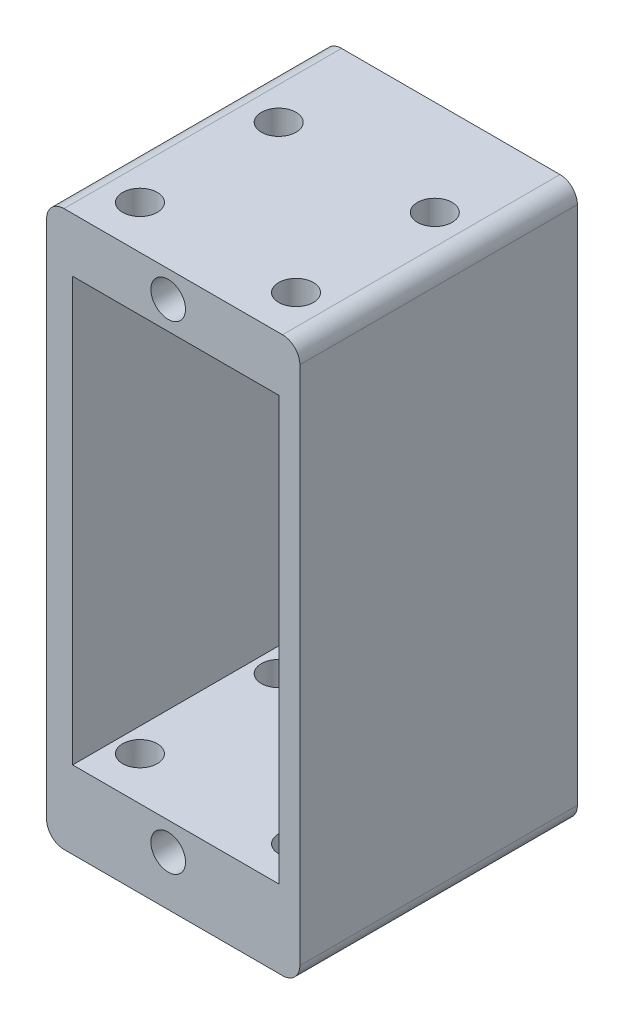
ISO-10303-21;
HEADER;
FILE_DESCRIPTION(('STEP AP214'),'2;1');
FILE_NAME('part.step','',(''),(''),'','','');
FILE_SCHEMA(('AUTOMOTIVE_DESIGN { 1 0 10303 214 1 1 1 1 }'));
ENDSEC;
DATA;
#1=APPLICATION_CONTEXT('core data for automotive mechanical design processes');
#2=APPLICATION_PROTOCOL_DEFINITION('international standard','automotive_design',2000,#1);
#3=PRODUCT_CONTEXT('',#1,'mechanical');
#4=PRODUCT('Part','Part','',(#3));
#5=PRODUCT_RELATED_PRODUCT_CATEGORY('part','',(#4));
#6=PRODUCT_DEFINITION_FORMATION('','',#4);
#7=PRODUCT_DEFINITION_CONTEXT('part definition',#1,'design');
#8=PRODUCT_DEFINITION('design','',#6,#7);
#9=PRODUCT_DEFINITION_SHAPE('','',#8);
#10=(LENGTH_UNIT() NAMED_UNIT(*) SI_UNIT(.MILLI.,.METRE.));
#11=(NAMED_UNIT(*) PLANE_ANGLE_UNIT() SI_UNIT($,.RADIAN.));
#12=(NAMED_UNIT(*) SI_UNIT($,.STERADIAN.) SOLID_ANGLE_UNIT());
#13=UNCERTAINTY_MEASURE_WITH_UNIT(LENGTH_MEASURE(1.E-05),#10,'distance_accuracy_value','');
#14=(GEOMETRIC_REPRESENTATION_CONTEXT(3) GLOBAL_UNCERTAINTY_ASSIGNED_CONTEXT((#13)) GLOBAL_UNIT_ASSIGNED_CONTEXT((#10,
#11,#12)) REPRESENTATION_CONTEXT('',''));
#15=CARTESIAN_POINT('',(0.,0.,0.));
#16=DIRECTION('',(0.,0.,1.));
#17=DIRECTION('',(1.,0.,0.));
#18=AXIS2_PLACEMENT_3D('',#15,#16,#17);
#19=CARTESIAN_POINT('',(-106.71772522006,235.327818509475,16.));
#20=DIRECTION('',(1.,0.,0.));
#21=DIRECTION('',(0.,0.,-1.));
#22=AXIS2_PLACEMENT_3D('',#19,#20,#21);
#23=PLANE('',#22);
#24=DIRECTION('',(0.,-1.,0.));
#25=VECTOR('',#24,1.);
#26=CARTESIAN_POINT('',(-106.71772522006,235.327818509475,0.));
#27=LINE('',#26,#25);
#28=CARTESIAN_POINT('',(-106.71772522006,234.327818509475,0.));
#29=VERTEX_POINT('',#28);
#30=CARTESIAN_POINT('',(-106.71772522006,204.327818509475,0.));
#31=VERTEX_POINT('',#30);
#32=EDGE_CURVE('E166',#29,#31,#27,.T.);
#33=ORIENTED_EDGE('',*,*,#32,.T.);
#34=DIRECTION('',(0.,0.,-1.));
#35=VECTOR('',#34,1.);
#36=CARTESIAN_POINT('',(-106.71772522006,204.327818509475,16.));
#37=LINE('',#36,#35);
#38=CARTESIAN_POINT('',(-106.71772522006,204.327818509475,16.));
#39=VERTEX_POINT('',#38);
#40=EDGE_CURVE('E222',#31,#39,#37,.F.);
#41=ORIENTED_EDGE('',*,*,#40,.T.);
#42=DIRECTION('',(0.,-1.,0.));
#43=VECTOR('',#42,1.);
#44=CARTESIAN_POINT('',(-106.71772522006,235.327818509475,16.));
#45=LINE('',#44,#43);
#46=CARTESIAN_POINT('',(-106.71772522006,234.327818509475,16.));
#47=VERTEX_POINT('',#46);
#48=EDGE_CURVE('E170',#47,#39,#45,.T.);
#49=ORIENTED_EDGE('',*,*,#48,.F.);
#50=DIRECTION('',(0.,0.,-1.));
#51=VECTOR('',#50,1.);
#52=CARTESIAN_POINT('',(-106.71772522006,234.327818509475,16.));
#53=LINE('',#52,#51);
#54=EDGE_CURVE('E219',#47,#29,#53,.T.);
#55=ORIENTED_EDGE('',*,*,#54,.T.);
#56=EDGE_LOOP('',(#33,#41,#49,#55));
#57=FACE_BOUND('',#56,.T.);
#58=ADVANCED_FACE('F38',(#57),#23,.F.);
#59=CARTESIAN_POINT('',(-106.71772522006,203.327818509475,16.));
#60=DIRECTION('',(0.,1.,0.));
#61=DIRECTION('',(0.,0.,1.));
#62=AXIS2_PLACEMENT_3D('',#59,#60,#61);
#63=PLANE('',#62);
#64=CARTESIAN_POINT('',(-103.837557168766,203.327818509475,13.5));
#65=DIRECTION('',(0.,1.,0.));
#66=DIRECTION('',(0.,0.,1.));
#67=AXIS2_PLACEMENT_3D('',#64,#65,#66);
#68=CIRCLE('',#67,0.999999999999998);
#69=CARTESIAN_POINT('',(-103.837557168766,203.327818509475,14.5));
#70=VERTEX_POINT('',#69);
#71=EDGE_CURVE('E369',#70,#70,#68,.T.);
#72=ORIENTED_EDGE('',*,*,#71,.T.);
#73=EDGE_LOOP('',(#72));
#74=FACE_BOUND('',#73,.T.);
#75=CARTESIAN_POINT('',(-94.8375571687659,203.327818509475,13.5));
#76=DIRECTION('',(0.,1.,0.));
#77=DIRECTION('',(0.,0.,1.));
#78=AXIS2_PLACEMENT_3D('',#75,#76,#77);
#79=CIRCLE('',#78,0.999999999999998);
#80=CARTESIAN_POINT('',(-94.8375571687659,203.327818509475,14.5));
#81=VERTEX_POINT('',#80);
#82=EDGE_CURVE('E372',#81,#81,#79,.T.);
#83=ORIENTED_EDGE('',*,*,#82,.T.);
#84=EDGE_LOOP('',(#83));
#85=FACE_BOUND('',#84,.T.);
#86=CARTESIAN_POINT('',(-94.837557168766,203.327818509475,5.5));
#87=DIRECTION('',(0.,1.,0.));
#88=DIRECTION('',(0.,0.,1.));
#89=AXIS2_PLACEMENT_3D('',#86,#87,#88);
#90=CIRCLE('',#89,0.999999999999998);
#91=CARTESIAN_POINT('',(-94.837557168766,203.327818509475,6.5));
#92=VERTEX_POINT('',#91);
#93=EDGE_CURVE('E362',#92,#92,#90,.T.);
#94=ORIENTED_EDGE('',*,*,#93,.T.);
#95=EDGE_LOOP('',(#94));
#96=FACE_BOUND('',#95,.T.);
#97=CARTESIAN_POINT('',(-103.837557168766,203.327818509475,5.5));
#98=DIRECTION('',(0.,1.,0.));
#99=DIRECTION('',(0.,0.,1.));
#100=AXIS2_PLACEMENT_3D('',#97,#98,#99);
#101=CIRCLE('',#100,0.999999999999998);
#102=CARTESIAN_POINT('',(-103.837557168766,203.327818509475,6.5));
#103=VERTEX_POINT('',#102);
#104=EDGE_CURVE('E229',#103,#103,#101,.T.);
#105=ORIENTED_EDGE('',*,*,#104,.T.);
#106=EDGE_LOOP('',(#105));
#107=FACE_BOUND('',#106,.T.);
#108=DIRECTION('',(1.,0.,0.));
#109=VECTOR('',#108,1.);
#110=CARTESIAN_POINT('',(-106.71772522006,203.327818509475,0.));
#111=LINE('',#110,#109);
#112=CARTESIAN_POINT('',(-105.71772522006,203.327818509475,0.));
#113=VERTEX_POINT('',#112);
#114=CARTESIAN_POINT('',(-93.1177252200604,203.327818509475,0.));
#115=VERTEX_POINT('',#114);
#116=EDGE_CURVE('E186',#113,#115,#111,.T.);
#117=ORIENTED_EDGE('',*,*,#116,.T.);
#118=DIRECTION('',(0.,0.,-1.));
#119=VECTOR('',#118,1.);
#120=CARTESIAN_POINT('',(-93.1177252200604,203.327818509475,16.));
#121=LINE('',#120,#119);
#122=CARTESIAN_POINT('',(-93.1177252200604,203.327818509475,16.));
#123=VERTEX_POINT('',#122);
#124=EDGE_CURVE('E209',#115,#123,#121,.F.);
#125=ORIENTED_EDGE('',*,*,#124,.T.);
#126=DIRECTION('',(1.,0.,0.));
#127=VECTOR('',#126,1.);
#128=CARTESIAN_POINT('',(-106.71772522006,203.327818509475,16.));
#129=LINE('',#128,#127);
#130=CARTESIAN_POINT('',(-105.71772522006,203.327818509475,16.));
#131=VERTEX_POINT('',#130);
#132=EDGE_CURVE('E173',#131,#123,#129,.T.);
#133=ORIENTED_EDGE('',*,*,#132,.F.);
#134=DIRECTION('',(0.,0.,-1.));
#135=VECTOR('',#134,1.);
#136=CARTESIAN_POINT('',(-105.71772522006,203.327818509475,16.));
#137=LINE('',#136,#135);
#138=EDGE_CURVE('E206',#131,#113,#137,.T.);
#139=ORIENTED_EDGE('',*,*,#138,.T.);
#140=EDGE_LOOP('',(#117,#125,#133,#139));
#141=FACE_BOUND('',#140,.T.);
#142=ADVANCED_FACE('F303',(#74,#85,#96,#107,#141),#63,.F.);
#143=CARTESIAN_POINT('',(-92.1177252200604,235.327818509475,16.));
#144=DIRECTION('',(-1.,0.,0.));
#145=DIRECTION('',(0.,0.,1.));
#146=AXIS2_PLACEMENT_3D('',#143,#144,#145);
#147=PLANE('',#146);
#148=DIRECTION('',(0.,1.,0.));
#149=VECTOR('',#148,1.);
#150=CARTESIAN_POINT('',(-92.1177252200604,235.327818509475,16.));
#151=LINE('',#150,#149);
#152=CARTESIAN_POINT('',(-92.1177252200604,204.327818509475,16.));
#153=VERTEX_POINT('',#152);
#154=CARTESIAN_POINT('',(-92.1177252200604,234.327818509475,16.));
#155=VERTEX_POINT('',#154);
#156=EDGE_CURVE('E177',#153,#155,#151,.T.);
#157=ORIENTED_EDGE('',*,*,#156,.F.);
#158=DIRECTION('',(0.,0.,-1.));
#159=VECTOR('',#158,1.);
#160=CARTESIAN_POINT('',(-92.1177252200604,204.327818509475,16.));
#161=LINE('',#160,#159);
#162=CARTESIAN_POINT('',(-92.1177252200604,204.327818509475,0.));
#163=VERTEX_POINT('',#162);
#164=EDGE_CURVE('E195',#153,#163,#161,.T.);
#165=ORIENTED_EDGE('',*,*,#164,.T.);
#166=DIRECTION('',(0.,1.,0.));
#167=VECTOR('',#166,1.);
#168=CARTESIAN_POINT('',(-92.1177252200604,235.327818509475,0.));
#169=LINE('',#168,#167);
#170=CARTESIAN_POINT('',(-92.1177252200604,234.327818509475,0.));
#171=VERTEX_POINT('',#170);
#172=EDGE_CURVE('E189',#163,#171,#169,.T.);
#173=ORIENTED_EDGE('',*,*,#172,.T.);
#174=DIRECTION('',(0.,0.,-1.));
#175=VECTOR('',#174,1.);
#176=CARTESIAN_POINT('',(-92.1177252200604,234.327818509475,16.));
#177=LINE('',#176,#175);
#178=EDGE_CURVE('E183',#171,#155,#177,.F.);
#179=ORIENTED_EDGE('',*,*,#178,.T.);
#180=EDGE_LOOP('',(#157,#165,#173,#179));
#181=FACE_BOUND('',#180,.T.);
#182=ADVANCED_FACE('F283',(#181),#147,.F.);
#183=CARTESIAN_POINT('',(-106.71772522006,235.327818509475,16.));
#184=DIRECTION('',(0.,-1.,0.));
#185=DIRECTION('',(0.,0.,-1.));
#186=AXIS2_PLACEMENT_3D('',#183,#184,#185);
#187=PLANE('',#186);
#188=CARTESIAN_POINT('',(-103.837557168766,235.327818509475,13.5));
#189=DIRECTION('',(0.,1.,0.));
#190=DIRECTION('',(0.,0.,1.));
#191=AXIS2_PLACEMENT_3D('',#188,#189,#190);
#192=CIRCLE('',#191,0.999999999999998);
#193=CARTESIAN_POINT('',(-103.837557168766,235.327818509475,14.5));
#194=VERTEX_POINT('',#193);
#195=EDGE_CURVE('E349',#194,#194,#192,.T.);
#196=ORIENTED_EDGE('',*,*,#195,.F.);
#197=EDGE_LOOP('',(#196));
#198=FACE_BOUND('',#197,.T.);
#199=CARTESIAN_POINT('',(-94.8375571687659,235.327818509475,13.5));
#200=DIRECTION('',(0.,1.,0.));
#201=DIRECTION('',(0.,0.,1.));
#202=AXIS2_PLACEMENT_3D('',#199,#200,#201);
#203=CIRCLE('',#202,0.999999999999998);
#204=CARTESIAN_POINT('',(-94.8375571687659,235.327818509475,14.5));
#205=VERTEX_POINT('',#204);
#206=EDGE_CURVE('E353',#205,#205,#203,.T.);
#207=ORIENTED_EDGE('',*,*,#206,.F.);
#208=EDGE_LOOP('',(#207));
#209=FACE_BOUND('',#208,.T.);
#210=CARTESIAN_POINT('',(-94.837557168766,235.327818509475,5.5));
#211=DIRECTION('',(0.,1.,0.));
#212=DIRECTION('',(0.,0.,1.));
#213=AXIS2_PLACEMENT_3D('',#210,#211,#212);
#214=CIRCLE('',#213,0.999999999999998);
#215=CARTESIAN_POINT('',(-94.837557168766,235.327818509475,6.5));
#216=VERTEX_POINT('',#215);
#217=EDGE_CURVE('E357',#216,#216,#214,.T.);
#218=ORIENTED_EDGE('',*,*,#217,.F.);
#219=EDGE_LOOP('',(#218));
#220=FACE_BOUND('',#219,.T.);
#221=CARTESIAN_POINT('',(-103.837557168766,235.327818509475,5.5));
#222=DIRECTION('',(0.,1.,0.));
#223=DIRECTION('',(0.,0.,1.));
#224=AXIS2_PLACEMENT_3D('',#221,#222,#223);
#225=CIRCLE('',#224,0.999999999999998);
#226=CARTESIAN_POINT('',(-103.837557168766,235.327818509475,6.5));
#227=VERTEX_POINT('',#226);
#228=EDGE_CURVE('E360',#227,#227,#225,.T.);
#229=ORIENTED_EDGE('',*,*,#228,.F.);
#230=EDGE_LOOP('',(#229));
#231=FACE_BOUND('',#230,.T.);
#232=DIRECTION('',(-1.,0.,0.));
#233=VECTOR('',#232,1.);
#234=CARTESIAN_POINT('',(-106.71772522006,235.327818509475,16.));
#235=LINE('',#234,#233);
#236=CARTESIAN_POINT('',(-93.1177252200604,235.327818509475,16.));
#237=VERTEX_POINT('',#236);
#238=CARTESIAN_POINT('',(-105.71772522006,235.327818509475,16.));
#239=VERTEX_POINT('',#238);
#240=EDGE_CURVE('E180',#237,#239,#235,.T.);
#241=ORIENTED_EDGE('',*,*,#240,.F.);
#242=DIRECTION('',(0.,0.,-1.));
#243=VECTOR('',#242,1.);
#244=CARTESIAN_POINT('',(-93.1177252200604,235.327818509475,16.));
#245=LINE('',#244,#243);
#246=CARTESIAN_POINT('',(-93.1177252200604,235.327818509475,0.));
#247=VERTEX_POINT('',#246);
#248=EDGE_CURVE('E11',#237,#247,#245,.T.);
#249=ORIENTED_EDGE('',*,*,#248,.T.);
#250=DIRECTION('',(-1.,0.,0.));
#251=VECTOR('',#250,1.);
#252=CARTESIAN_POINT('',(-106.71772522006,235.327818509475,0.));
#253=LINE('',#252,#251);
#254=CARTESIAN_POINT('',(-105.71772522006,235.327818509475,0.));
#255=VERTEX_POINT('',#254);
#256=EDGE_CURVE('E174',#247,#255,#253,.T.);
#257=ORIENTED_EDGE('',*,*,#256,.T.);
#258=DIRECTION('',(0.,0.,-1.));
#259=VECTOR('',#258,1.);
#260=CARTESIAN_POINT('',(-105.71772522006,235.327818509475,16.));
#261=LINE('',#260,#259);
#262=EDGE_CURVE('E47',#255,#239,#261,.F.);
#263=ORIENTED_EDGE('',*,*,#262,.T.);
#264=EDGE_LOOP('',(#241,#249,#257,#263));
#265=FACE_BOUND('',#264,.T.);
#266=ADVANCED_FACE('F266',(#198,#209,#220,#231,#265),#187,.F.);
#267=CARTESIAN_POINT('',(0.,0.,16.));
#268=DIRECTION('',(0.,0.,1.));
#269=DIRECTION('',(1.,0.,0.));
#270=AXIS2_PLACEMENT_3D('',#267,#268,#269);
#271=PLANE('',#270);
#272=CARTESIAN_POINT('',(-99.7091223045707,233.799996948242,16.));
#273=DIRECTION('',(0.,0.,1.));
#274=DIRECTION('',(1.,0.,0.));
#275=AXIS2_PLACEMENT_3D('',#272,#273,#274);
#276=CIRCLE('',#275,0.999999999999998);
#277=CARTESIAN_POINT('',(-98.7091223045707,233.799996948242,16.));
#278=VERTEX_POINT('',#277);
#279=EDGE_CURVE('E252',#278,#278,#276,.T.);
#280=ORIENTED_EDGE('',*,*,#279,.F.);
#281=EDGE_LOOP('',(#280));
#282=FACE_BOUND('',#281,.T.);
#283=CARTESIAN_POINT('',(-99.7091223045707,206.199996948242,16.));
#284=DIRECTION('',(0.,0.,1.));
#285=DIRECTION('',(1.,0.,0.));
#286=AXIS2_PLACEMENT_3D('',#283,#284,#285);
#287=CIRCLE('',#286,0.999999999999998);
#288=CARTESIAN_POINT('',(-98.7091223045707,206.199996948242,16.));
#289=VERTEX_POINT('',#288);
#290=EDGE_CURVE('E153',#289,#289,#287,.T.);
#291=ORIENTED_EDGE('',*,*,#290,.F.);
#292=EDGE_LOOP('',(#291));
#293=FACE_BOUND('',#292,.T.);
#294=DIRECTION('',(0.,-1.,0.));
#295=VECTOR('',#294,1.);
#296=CARTESIAN_POINT('',(-105.21772522006,232.199996948242,16.));
#297=LINE('',#296,#295);
#298=CARTESIAN_POINT('',(-105.21772522006,232.199996948242,16.));
#299=VERTEX_POINT('',#298);
#300=CARTESIAN_POINT('',(-105.21772522006,207.799996948242,16.));
#301=VERTEX_POINT('',#300);
#302=EDGE_CURVE('E55',#299,#301,#297,.T.);
#303=ORIENTED_EDGE('',*,*,#302,.F.);
#304=DIRECTION('',(-1.,0.,0.));
#305=VECTOR('',#304,1.);
#306=CARTESIAN_POINT('',(-105.21772522006,232.199996948242,16.));
#307=LINE('',#306,#305);
#308=CARTESIAN_POINT('',(-93.3177252200605,232.199996948242,16.));
#309=VERTEX_POINT('',#308);
#310=EDGE_CURVE('E147',#309,#299,#307,.T.);
#311=ORIENTED_EDGE('',*,*,#310,.F.);
#312=DIRECTION('',(0.,1.,0.));
#313=VECTOR('',#312,1.);
#314=CARTESIAN_POINT('',(-93.3177252200605,232.199996948242,16.));
#315=LINE('',#314,#313);
#316=CARTESIAN_POINT('',(-93.3177252200605,207.799996948242,16.));
#317=VERTEX_POINT('',#316);
#318=EDGE_CURVE('E150',#317,#309,#315,.T.);
#319=ORIENTED_EDGE('',*,*,#318,.F.);
#320=DIRECTION('',(1.,0.,0.));
#321=VECTOR('',#320,1.);
#322=CARTESIAN_POINT('',(-105.21772522006,207.799996948242,16.));
#323=LINE('',#322,#321);
#324=EDGE_CURVE('E159',#301,#317,#323,.T.);
#325=ORIENTED_EDGE('',*,*,#324,.F.);
#326=EDGE_LOOP('',(#303,#311,#319,#325));
#327=FACE_BOUND('',#326,.T.);
#328=ORIENTED_EDGE('',*,*,#132,.T.);
#329=CARTESIAN_POINT('',(-93.1177252200604,204.327818509475,16.));
#330=DIRECTION('',(0.,0.,1.));
#331=DIRECTION('',(1.,0.,0.));
#332=AXIS2_PLACEMENT_3D('',#329,#330,#331);
#333=CIRCLE('',#332,1.);
#334=EDGE_CURVE('E217',#123,#153,#333,.T.);
#335=ORIENTED_EDGE('',*,*,#334,.T.);
#336=ORIENTED_EDGE('',*,*,#156,.T.);
#337=CARTESIAN_POINT('',(-93.1177252200604,234.327818509475,16.));
#338=DIRECTION('',(0.,0.,1.));
#339=DIRECTION('',(1.,0.,0.));
#340=AXIS2_PLACEMENT_3D('',#337,#338,#339);
#341=CIRCLE('',#340,1.);
#342=EDGE_CURVE('E213',#155,#237,#341,.T.);
#343=ORIENTED_EDGE('',*,*,#342,.T.);
#344=ORIENTED_EDGE('',*,*,#240,.T.);
#345=CARTESIAN_POINT('',(-105.71772522006,234.327818509475,16.));
#346=DIRECTION('',(0.,0.,1.));
#347=DIRECTION('',(1.,0.,0.));
#348=AXIS2_PLACEMENT_3D('',#345,#346,#347);
#349=CIRCLE('',#348,1.);
#350=EDGE_CURVE('E211',#239,#47,#349,.T.);
#351=ORIENTED_EDGE('',*,*,#350,.T.);
#352=ORIENTED_EDGE('',*,*,#48,.T.);
#353=CARTESIAN_POINT('',(-105.71772522006,204.327818509475,16.));
#354=DIRECTION('',(0.,0.,1.));
#355=DIRECTION('',(1.,0.,0.));
#356=AXIS2_PLACEMENT_3D('',#353,#354,#355);
#357=CIRCLE('',#356,1.);
#358=EDGE_CURVE('E215',#39,#131,#357,.T.);
#359=ORIENTED_EDGE('',*,*,#358,.T.);
#360=EDGE_LOOP('',(#328,#335,#336,#343,#344,#351,#352,#359));
#361=FACE_BOUND('',#360,.T.);
#362=ADVANCED_FACE('F263',(#282,#293,#327,#361),#271,.T.);
#363=CARTESIAN_POINT('',(0.,0.,0.));
#364=DIRECTION('',(0.,0.,1.));
#365=DIRECTION('',(1.,0.,0.));
#366=AXIS2_PLACEMENT_3D('',#363,#364,#365);
#367=PLANE('',#366);
#368=CARTESIAN_POINT('',(-99.7091223045707,233.799996948242,0.));
#369=DIRECTION('',(0.,0.,1.));
#370=DIRECTION('',(1.,0.,0.));
#371=AXIS2_PLACEMENT_3D('',#368,#369,#370);
#372=CIRCLE('',#371,0.999999999999998);
#373=CARTESIAN_POINT('',(-98.7091223045707,233.799996948242,0.));
#374=VERTEX_POINT('',#373);
#375=EDGE_CURVE('E160',#374,#374,#372,.T.);
#376=ORIENTED_EDGE('',*,*,#375,.T.);
#377=EDGE_LOOP('',(#376));
#378=FACE_BOUND('',#377,.T.);
#379=CARTESIAN_POINT('',(-99.7091223045707,206.199996948242,0.));
#380=DIRECTION('',(0.,0.,1.));
#381=DIRECTION('',(1.,0.,0.));
#382=AXIS2_PLACEMENT_3D('',#379,#380,#381);
#383=CIRCLE('',#382,0.999999999999998);
#384=CARTESIAN_POINT('',(-98.7091223045707,206.199996948242,0.));
#385=VERTEX_POINT('',#384);
#386=EDGE_CURVE('E254',#385,#385,#383,.T.);
#387=ORIENTED_EDGE('',*,*,#386,.T.);
#388=EDGE_LOOP('',(#387));
#389=FACE_BOUND('',#388,.T.);
#390=DIRECTION('',(-1.,0.,0.));
#391=VECTOR('',#390,1.);
#392=CARTESIAN_POINT('',(-105.21772522006,232.199996948242,0.));
#393=LINE('',#392,#391);
#394=CARTESIAN_POINT('',(-93.3177252200605,232.199996948242,0.));
#395=VERTEX_POINT('',#394);
#396=CARTESIAN_POINT('',(-105.21772522006,232.199996948242,0.));
#397=VERTEX_POINT('',#396);
#398=EDGE_CURVE('E137',#395,#397,#393,.T.);
#399=ORIENTED_EDGE('',*,*,#398,.T.);
#400=DIRECTION('',(0.,-1.,0.));
#401=VECTOR('',#400,1.);
#402=CARTESIAN_POINT('',(-105.21772522006,232.199996948242,0.));
#403=LINE('',#402,#401);
#404=CARTESIAN_POINT('',(-105.21772522006,207.799996948242,0.));
#405=VERTEX_POINT('',#404);
#406=EDGE_CURVE('E131',#397,#405,#403,.T.);
#407=ORIENTED_EDGE('',*,*,#406,.T.);
#408=DIRECTION('',(1.,0.,0.));
#409=VECTOR('',#408,1.);
#410=CARTESIAN_POINT('',(-105.21772522006,207.799996948242,0.));
#411=LINE('',#410,#409);
#412=CARTESIAN_POINT('',(-93.3177252200605,207.799996948242,0.));
#413=VERTEX_POINT('',#412);
#414=EDGE_CURVE('E140',#405,#413,#411,.T.);
#415=ORIENTED_EDGE('',*,*,#414,.T.);
#416=DIRECTION('',(0.,1.,0.));
#417=VECTOR('',#416,1.);
#418=CARTESIAN_POINT('',(-93.3177252200605,232.199996948242,0.));
#419=LINE('',#418,#417);
#420=EDGE_CURVE('E63',#413,#395,#419,.T.);
#421=ORIENTED_EDGE('',*,*,#420,.T.);
#422=EDGE_LOOP('',(#399,#407,#415,#421));
#423=FACE_BOUND('',#422,.T.);
#424=ORIENTED_EDGE('',*,*,#172,.F.);
#425=CARTESIAN_POINT('',(-93.1177252200604,204.327818509475,0.));
#426=DIRECTION('',(0.,0.,1.));
#427=DIRECTION('',(1.,0.,0.));
#428=AXIS2_PLACEMENT_3D('',#425,#426,#427);
#429=CIRCLE('',#428,1.);
#430=EDGE_CURVE('E204',#163,#115,#429,.F.);
#431=ORIENTED_EDGE('',*,*,#430,.T.);
#432=ORIENTED_EDGE('',*,*,#116,.F.);
#433=CARTESIAN_POINT('',(-105.71772522006,204.327818509475,0.));
#434=DIRECTION('',(0.,0.,1.));
#435=DIRECTION('',(1.,0.,0.));
#436=AXIS2_PLACEMENT_3D('',#433,#434,#435);
#437=CIRCLE('',#436,1.);
#438=EDGE_CURVE('E202',#113,#31,#437,.F.);
#439=ORIENTED_EDGE('',*,*,#438,.T.);
#440=ORIENTED_EDGE('',*,*,#32,.F.);
#441=CARTESIAN_POINT('',(-105.71772522006,234.327818509475,0.));
#442=DIRECTION('',(0.,0.,1.));
#443=DIRECTION('',(1.,0.,0.));
#444=AXIS2_PLACEMENT_3D('',#441,#442,#443);
#445=CIRCLE('',#444,1.);
#446=EDGE_CURVE('E198',#29,#255,#445,.F.);
#447=ORIENTED_EDGE('',*,*,#446,.T.);
#448=ORIENTED_EDGE('',*,*,#256,.F.);
#449=CARTESIAN_POINT('',(-93.1177252200604,234.327818509475,0.));
#450=DIRECTION('',(0.,0.,1.));
#451=DIRECTION('',(1.,0.,0.));
#452=AXIS2_PLACEMENT_3D('',#449,#450,#451);
#453=CIRCLE('',#452,1.);
#454=EDGE_CURVE('E200',#247,#171,#453,.F.);
#455=ORIENTED_EDGE('',*,*,#454,.T.);
#456=EDGE_LOOP('',(#424,#431,#432,#439,#440,#447,#448,#455));
#457=FACE_BOUND('',#456,.T.);
#458=ADVANCED_FACE('F144',(#378,#389,#423,#457),#367,.F.);
#459=CARTESIAN_POINT('',(-93.1177252200604,204.327818509475,16.));
#460=DIRECTION('',(0.,0.,-1.));
#461=DIRECTION('',(-1.,0.,0.));
#462=AXIS2_PLACEMENT_3D('',#459,#460,#461);
#463=CYLINDRICAL_SURFACE('',#462,1.);
#464=ORIENTED_EDGE('',*,*,#334,.F.);
#465=ORIENTED_EDGE('',*,*,#124,.F.);
#466=ORIENTED_EDGE('',*,*,#430,.F.);
#467=ORIENTED_EDGE('',*,*,#164,.F.);
#468=EDGE_LOOP('',(#464,#465,#466,#467));
#469=FACE_BOUND('',#468,.T.);
#470=ADVANCED_FACE('F280',(#469),#463,.T.);
#471=CARTESIAN_POINT('',(-105.71772522006,204.327818509475,16.));
#472=DIRECTION('',(0.,0.,-1.));
#473=DIRECTION('',(-1.,0.,0.));
#474=AXIS2_PLACEMENT_3D('',#471,#472,#473);
#475=CYLINDRICAL_SURFACE('',#474,1.);
#476=ORIENTED_EDGE('',*,*,#358,.F.);
#477=ORIENTED_EDGE('',*,*,#40,.F.);
#478=ORIENTED_EDGE('',*,*,#438,.F.);
#479=ORIENTED_EDGE('',*,*,#138,.F.);
#480=EDGE_LOOP('',(#476,#477,#478,#479));
#481=FACE_BOUND('',#480,.T.);
#482=ADVANCED_FACE('F302',(#481),#475,.T.);
#483=CARTESIAN_POINT('',(-93.1177252200604,234.327818509475,16.));
#484=DIRECTION('',(0.,0.,-1.));
#485=DIRECTION('',(-1.,0.,0.));
#486=AXIS2_PLACEMENT_3D('',#483,#484,#485);
#487=CYLINDRICAL_SURFACE('',#486,1.);
#488=ORIENTED_EDGE('',*,*,#342,.F.);
#489=ORIENTED_EDGE('',*,*,#178,.F.);
#490=ORIENTED_EDGE('',*,*,#454,.F.);
#491=ORIENTED_EDGE('',*,*,#248,.F.);
#492=EDGE_LOOP('',(#488,#489,#490,#491));
#493=FACE_BOUND('',#492,.T.);
#494=ADVANCED_FACE('F290',(#493),#487,.T.);
#495=CARTESIAN_POINT('',(-105.71772522006,234.327818509475,16.));
#496=DIRECTION('',(0.,0.,-1.));
#497=DIRECTION('',(-1.,0.,0.));
#498=AXIS2_PLACEMENT_3D('',#495,#496,#497);
#499=CYLINDRICAL_SURFACE('',#498,1.);
#500=ORIENTED_EDGE('',*,*,#350,.F.);
#501=ORIENTED_EDGE('',*,*,#262,.F.);
#502=ORIENTED_EDGE('',*,*,#446,.F.);
#503=ORIENTED_EDGE('',*,*,#54,.F.);
#504=EDGE_LOOP('',(#500,#501,#502,#503));
#505=FACE_BOUND('',#504,.T.);
#506=ADVANCED_FACE('F40',(#505),#499,.T.);
#507=CARTESIAN_POINT('',(-105.21772522006,232.199996948242,0.));
#508=DIRECTION('',(-1.,0.,0.));
#509=DIRECTION('',(0.,0.,1.));
#510=AXIS2_PLACEMENT_3D('',#507,#508,#509);
#511=PLANE('',#510);
#512=ORIENTED_EDGE('',*,*,#302,.T.);
#513=DIRECTION('',(0.,0.,1.));
#514=VECTOR('',#513,1.);
#515=CARTESIAN_POINT('',(-105.21772522006,207.799996948242,0.));
#516=LINE('',#515,#514);
#517=EDGE_CURVE('E127',#405,#301,#516,.T.);
#518=ORIENTED_EDGE('',*,*,#517,.F.);
#519=ORIENTED_EDGE('',*,*,#406,.F.);
#520=DIRECTION('',(0.,0.,1.));
#521=VECTOR('',#520,1.);
#522=CARTESIAN_POINT('',(-105.21772522006,232.199996948242,0.));
#523=LINE('',#522,#521);
#524=EDGE_CURVE('E164',#397,#299,#523,.T.);
#525=ORIENTED_EDGE('',*,*,#524,.T.);
#526=EDGE_LOOP('',(#512,#518,#519,#525));
#527=FACE_BOUND('',#526,.T.);
#528=ADVANCED_FACE('F129',(#527),#511,.F.);
#529=CARTESIAN_POINT('',(-105.21772522006,232.199996948242,0.));
#530=DIRECTION('',(0.,1.,0.));
#531=DIRECTION('',(0.,0.,1.));
#532=AXIS2_PLACEMENT_3D('',#529,#530,#531);
#533=PLANE('',#532);
#534=CARTESIAN_POINT('',(-103.837557168766,232.199996948242,13.5));
#535=DIRECTION('',(0.,1.,0.));
#536=DIRECTION('',(0.,0.,1.));
#537=AXIS2_PLACEMENT_3D('',#534,#535,#536);
#538=CIRCLE('',#537,0.999999999999998);
#539=CARTESIAN_POINT('',(-103.837557168766,232.199996948242,14.5));
#540=VERTEX_POINT('',#539);
#541=EDGE_CURVE('E247',#540,#540,#538,.T.);
#542=ORIENTED_EDGE('',*,*,#541,.T.);
#543=EDGE_LOOP('',(#542));
#544=FACE_BOUND('',#543,.T.);
#545=CARTESIAN_POINT('',(-94.8375571687659,232.199996948242,13.5));
#546=DIRECTION('',(0.,1.,0.));
#547=DIRECTION('',(0.,0.,1.));
#548=AXIS2_PLACEMENT_3D('',#545,#546,#547);
#549=CIRCLE('',#548,0.999999999999998);
#550=CARTESIAN_POINT('',(-94.8375571687659,232.199996948242,14.5));
#551=VERTEX_POINT('',#550);
#552=EDGE_CURVE('E235',#551,#551,#549,.T.);
#553=ORIENTED_EDGE('',*,*,#552,.T.);
#554=EDGE_LOOP('',(#553));
#555=FACE_BOUND('',#554,.T.);
#556=CARTESIAN_POINT('',(-94.837557168766,232.199996948242,5.5));
#557=DIRECTION('',(0.,1.,0.));
#558=DIRECTION('',(0.,0.,1.));
#559=AXIS2_PLACEMENT_3D('',#556,#557,#558);
#560=CIRCLE('',#559,0.999999999999998);
#561=CARTESIAN_POINT('',(-94.837557168766,232.199996948242,6.5));
#562=VERTEX_POINT('',#561);
#563=EDGE_CURVE('E232',#562,#562,#560,.T.);
#564=ORIENTED_EDGE('',*,*,#563,.T.);
#565=EDGE_LOOP('',(#564));
#566=FACE_BOUND('',#565,.T.);
#567=CARTESIAN_POINT('',(-103.837557168766,232.199996948242,5.5));
#568=DIRECTION('',(0.,1.,0.));
#569=DIRECTION('',(0.,0.,1.));
#570=AXIS2_PLACEMENT_3D('',#567,#568,#569);
#571=CIRCLE('',#570,0.999999999999998);
#572=CARTESIAN_POINT('',(-103.837557168766,232.199996948242,6.5));
#573=VERTEX_POINT('',#572);
#574=EDGE_CURVE('E228',#573,#573,#571,.T.);
#575=ORIENTED_EDGE('',*,*,#574,.T.);
#576=EDGE_LOOP('',(#575));
#577=FACE_BOUND('',#576,.T.);
#578=ORIENTED_EDGE('',*,*,#310,.T.);
#579=ORIENTED_EDGE('',*,*,#524,.F.);
#580=ORIENTED_EDGE('',*,*,#398,.F.);
#581=DIRECTION('',(0.,0.,1.));
#582=VECTOR('',#581,1.);
#583=CARTESIAN_POINT('',(-93.3177252200605,232.199996948242,0.));
#584=LINE('',#583,#582);
#585=EDGE_CURVE('E167',#395,#309,#584,.T.);
#586=ORIENTED_EDGE('',*,*,#585,.T.);
#587=EDGE_LOOP('',(#578,#579,#580,#586));
#588=FACE_BOUND('',#587,.T.);
#589=ADVANCED_FACE('F329',(#544,#555,#566,#577,#588),#533,.F.);
#590=CARTESIAN_POINT('',(-93.3177252200605,232.199996948242,0.));
#591=DIRECTION('',(1.,0.,0.));
#592=DIRECTION('',(0.,1.,0.));
#593=AXIS2_PLACEMENT_3D('',#590,#591,#592);
#594=PLANE('',#593);
#595=ORIENTED_EDGE('',*,*,#318,.T.);
#596=ORIENTED_EDGE('',*,*,#585,.F.);
#597=ORIENTED_EDGE('',*,*,#420,.F.);
#598=DIRECTION('',(0.,0.,1.));
#599=VECTOR('',#598,1.);
#600=CARTESIAN_POINT('',(-93.3177252200605,207.799996948242,0.));
#601=LINE('',#600,#599);
#602=EDGE_CURVE('E136',#413,#317,#601,.T.);
#603=ORIENTED_EDGE('',*,*,#602,.T.);
#604=EDGE_LOOP('',(#595,#596,#597,#603));
#605=FACE_BOUND('',#604,.T.);
#606=ADVANCED_FACE('F334',(#605),#594,.F.);
#607=CARTESIAN_POINT('',(-105.21772522006,207.799996948242,0.));
#608=DIRECTION('',(0.,-1.,0.));
#609=DIRECTION('',(0.,0.,-1.));
#610=AXIS2_PLACEMENT_3D('',#607,#608,#609);
#611=PLANE('',#610);
#612=CARTESIAN_POINT('',(-103.837557168766,207.799996948242,13.5));
#613=DIRECTION('',(0.,-1.,0.));
#614=DIRECTION('',(0.,0.,-1.));
#615=AXIS2_PLACEMENT_3D('',#612,#613,#614);
#616=CIRCLE('',#615,0.999999999999998);
#617=CARTESIAN_POINT('',(-103.837557168766,207.799996948242,12.5));
#618=VERTEX_POINT('',#617);
#619=EDGE_CURVE('E42',#618,#618,#616,.T.);
#620=ORIENTED_EDGE('',*,*,#619,.T.);
#621=EDGE_LOOP('',(#620));
#622=FACE_BOUND('',#621,.T.);
#623=CARTESIAN_POINT('',(-94.8375571687659,207.799996948242,13.5));
#624=DIRECTION('',(0.,-1.,0.));
#625=DIRECTION('',(0.,0.,-1.));
#626=AXIS2_PLACEMENT_3D('',#623,#624,#625);
#627=CIRCLE('',#626,0.999999999999998);
#628=CARTESIAN_POINT('',(-94.8375571687659,207.799996948242,12.5));
#629=VERTEX_POINT('',#628);
#630=EDGE_CURVE('E233',#629,#629,#627,.T.);
#631=ORIENTED_EDGE('',*,*,#630,.T.);
#632=EDGE_LOOP('',(#631));
#633=FACE_BOUND('',#632,.T.);
#634=CARTESIAN_POINT('',(-94.837557168766,207.799996948242,5.5));
#635=DIRECTION('',(0.,-1.,0.));
#636=DIRECTION('',(0.,0.,-1.));
#637=AXIS2_PLACEMENT_3D('',#634,#635,#636);
#638=CIRCLE('',#637,0.999999999999998);
#639=CARTESIAN_POINT('',(-94.837557168766,207.799996948242,4.5));
#640=VERTEX_POINT('',#639);
#641=EDGE_CURVE('E230',#640,#640,#638,.T.);
#642=ORIENTED_EDGE('',*,*,#641,.T.);
#643=EDGE_LOOP('',(#642));
#644=FACE_BOUND('',#643,.T.);
#645=CARTESIAN_POINT('',(-103.837557168766,207.799996948242,5.5));
#646=DIRECTION('',(0.,-1.,0.));
#647=DIRECTION('',(0.,0.,-1.));
#648=AXIS2_PLACEMENT_3D('',#645,#646,#647);
#649=CIRCLE('',#648,0.999999999999998);
#650=CARTESIAN_POINT('',(-103.837557168766,207.799996948242,4.5));
#651=VERTEX_POINT('',#650);
#652=EDGE_CURVE('E225',#651,#651,#649,.T.);
#653=ORIENTED_EDGE('',*,*,#652,.T.);
#654=EDGE_LOOP('',(#653));
#655=FACE_BOUND('',#654,.T.);
#656=ORIENTED_EDGE('',*,*,#324,.T.);
#657=ORIENTED_EDGE('',*,*,#602,.F.);
#658=ORIENTED_EDGE('',*,*,#414,.F.);
#659=ORIENTED_EDGE('',*,*,#517,.T.);
#660=EDGE_LOOP('',(#656,#657,#658,#659));
#661=FACE_BOUND('',#660,.T.);
#662=ADVANCED_FACE('F141',(#622,#633,#644,#655,#661),#611,.F.);
#663=CARTESIAN_POINT('',(-99.7091223045707,206.199996948242,0.));
#664=DIRECTION('',(0.,0.,1.));
#665=DIRECTION('',(1.,0.,0.));
#666=AXIS2_PLACEMENT_3D('',#663,#664,#665);
#667=CYLINDRICAL_SURFACE('',#666,0.999999999999998);
#668=ORIENTED_EDGE('',*,*,#386,.F.);
#669=EDGE_LOOP('',(#668));
#670=FACE_BOUND('',#669,.T.);
#671=ORIENTED_EDGE('',*,*,#290,.T.);
#672=EDGE_LOOP('',(#671));
#673=FACE_BOUND('',#672,.T.);
#674=ADVANCED_FACE('F261',(#670,#673),#667,.F.);
#675=CARTESIAN_POINT('',(-99.7091223045707,233.799996948242,0.));
#676=DIRECTION('',(0.,0.,1.));
#677=DIRECTION('',(1.,0.,0.));
#678=AXIS2_PLACEMENT_3D('',#675,#676,#677);
#679=CYLINDRICAL_SURFACE('',#678,0.999999999999998);
#680=ORIENTED_EDGE('',*,*,#375,.F.);
#681=EDGE_LOOP('',(#680));
#682=FACE_BOUND('',#681,.T.);
#683=ORIENTED_EDGE('',*,*,#279,.T.);
#684=EDGE_LOOP('',(#683));
#685=FACE_BOUND('',#684,.T.);
#686=ADVANCED_FACE('F401',(#682,#685),#679,.F.);
#687=CARTESIAN_POINT('',(-103.837557168766,203.327818509475,5.5));
#688=DIRECTION('',(0.,1.,0.));
#689=DIRECTION('',(0.,0.,1.));
#690=AXIS2_PLACEMENT_3D('',#687,#688,#689);
#691=CYLINDRICAL_SURFACE('',#690,0.999999999999998);
#692=ORIENTED_EDGE('',*,*,#104,.F.);
#693=EDGE_LOOP('',(#692));
#694=FACE_BOUND('',#693,.T.);
#695=ORIENTED_EDGE('',*,*,#652,.F.);
#696=EDGE_LOOP('',(#695));
#697=FACE_BOUND('',#696,.T.);
#698=ADVANCED_FACE('F393',(#694,#697),#691,.F.);
#699=CARTESIAN_POINT('',(-94.837557168766,203.327818509475,5.5));
#700=DIRECTION('',(0.,1.,0.));
#701=DIRECTION('',(0.,0.,1.));
#702=AXIS2_PLACEMENT_3D('',#699,#700,#701);
#703=CYLINDRICAL_SURFACE('',#702,0.999999999999998);
#704=ORIENTED_EDGE('',*,*,#93,.F.);
#705=EDGE_LOOP('',(#704));
#706=FACE_BOUND('',#705,.T.);
#707=ORIENTED_EDGE('',*,*,#641,.F.);
#708=EDGE_LOOP('',(#707));
#709=FACE_BOUND('',#708,.T.);
#710=ADVANCED_FACE('F382',(#706,#709),#703,.F.);
#711=CARTESIAN_POINT('',(-94.8375571687659,203.327818509475,13.5));
#712=DIRECTION('',(0.,1.,0.));
#713=DIRECTION('',(0.,0.,1.));
#714=AXIS2_PLACEMENT_3D('',#711,#712,#713);
#715=CYLINDRICAL_SURFACE('',#714,0.999999999999998);
#716=ORIENTED_EDGE('',*,*,#82,.F.);
#717=EDGE_LOOP('',(#716));
#718=FACE_BOUND('',#717,.T.);
#719=ORIENTED_EDGE('',*,*,#630,.F.);
#720=EDGE_LOOP('',(#719));
#721=FACE_BOUND('',#720,.T.);
#722=ADVANCED_FACE('F390',(#718,#721),#715,.F.);
#723=CARTESIAN_POINT('',(-103.837557168766,203.327818509475,13.5));
#724=DIRECTION('',(0.,1.,0.));
#725=DIRECTION('',(0.,0.,1.));
#726=AXIS2_PLACEMENT_3D('',#723,#724,#725);
#727=CYLINDRICAL_SURFACE('',#726,0.999999999999998);
#728=ORIENTED_EDGE('',*,*,#71,.F.);
#729=EDGE_LOOP('',(#728));
#730=FACE_BOUND('',#729,.T.);
#731=ORIENTED_EDGE('',*,*,#619,.F.);
#732=EDGE_LOOP('',(#731));
#733=FACE_BOUND('',#732,.T.);
#734=ADVANCED_FACE('F391',(#730,#733),#727,.F.);
#735=ORIENTED_EDGE('',*,*,#228,.T.);
#736=EDGE_LOOP('',(#735));
#737=FACE_BOUND('',#736,.T.);
#738=ORIENTED_EDGE('',*,*,#574,.F.);
#739=EDGE_LOOP('',(#738));
#740=FACE_BOUND('',#739,.T.);
#741=ADVANCED_FACE('F380',(#737,#740),#691,.F.);
#742=ORIENTED_EDGE('',*,*,#217,.T.);
#743=EDGE_LOOP('',(#742));
#744=FACE_BOUND('',#743,.T.);
#745=ORIENTED_EDGE('',*,*,#563,.F.);
#746=EDGE_LOOP('',(#745));
#747=FACE_BOUND('',#746,.T.);
#748=ADVANCED_FACE('F376',(#744,#747),#703,.F.);
#749=ORIENTED_EDGE('',*,*,#206,.T.);
#750=EDGE_LOOP('',(#749));
#751=FACE_BOUND('',#750,.T.);
#752=ORIENTED_EDGE('',*,*,#552,.F.);
#753=EDGE_LOOP('',(#752));
#754=FACE_BOUND('',#753,.T.);
#755=ADVANCED_FACE('F379',(#751,#754),#715,.F.);
#756=ORIENTED_EDGE('',*,*,#195,.T.);
#757=EDGE_LOOP('',(#756));
#758=FACE_BOUND('',#757,.T.);
#759=ORIENTED_EDGE('',*,*,#541,.F.);
#760=EDGE_LOOP('',(#759));
#761=FACE_BOUND('',#760,.T.);
#762=ADVANCED_FACE('F387',(#758,#761),#727,.F.);
#763=CLOSED_SHELL('',(#58,#142,#182,#266,#362,#458,#470,#482,#494,#506,#528,#589,#606,#662,#674,
#686,#698,#710,#722,#734,#741,#748,#755,#762));
#764=MANIFOLD_SOLID_BREP('B2',#763);
#765=ADVANCED_BREP_SHAPE_REPRESENTATION('',(#18,#764),#14);
#766=SHAPE_DEFINITION_REPRESENTATION(#9,#765);
ENDSEC;
END-ISO-10303-21;
